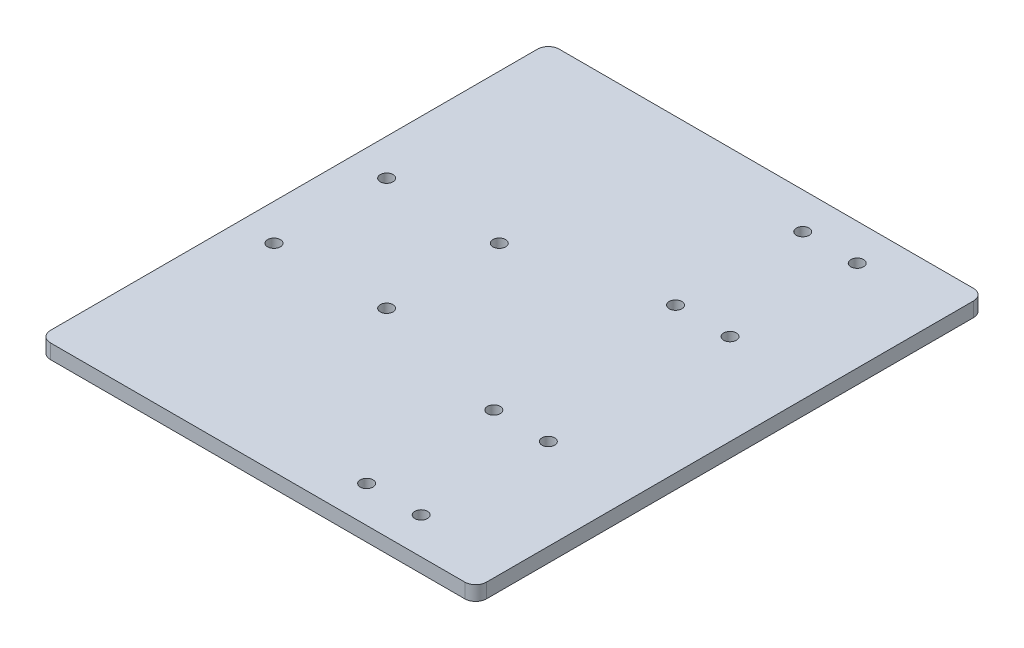
ISO-10303-21;
HEADER;
FILE_DESCRIPTION(('STEP AP214'),'2;1');
FILE_NAME('part.step','',(''),(''),'','','');
FILE_SCHEMA(('AUTOMOTIVE_DESIGN { 1 0 10303 214 1 1 1 1 }'));
ENDSEC;
DATA;
#1=APPLICATION_CONTEXT('core data for automotive mechanical design processes');
#2=APPLICATION_PROTOCOL_DEFINITION('international standard','automotive_design',2000,#1);
#3=PRODUCT_CONTEXT('',#1,'mechanical');
#4=PRODUCT('Part','Part','',(#3));
#5=PRODUCT_RELATED_PRODUCT_CATEGORY('part','',(#4));
#6=PRODUCT_DEFINITION_FORMATION('','',#4);
#7=PRODUCT_DEFINITION_CONTEXT('part definition',#1,'design');
#8=PRODUCT_DEFINITION('design','',#6,#7);
#9=PRODUCT_DEFINITION_SHAPE('','',#8);
#10=(LENGTH_UNIT() NAMED_UNIT(*) SI_UNIT(.MILLI.,.METRE.));
#11=(NAMED_UNIT(*) PLANE_ANGLE_UNIT() SI_UNIT($,.RADIAN.));
#12=(NAMED_UNIT(*) SI_UNIT($,.STERADIAN.) SOLID_ANGLE_UNIT());
#13=UNCERTAINTY_MEASURE_WITH_UNIT(LENGTH_MEASURE(1.E-05),#10,'distance_accuracy_value','');
#14=(GEOMETRIC_REPRESENTATION_CONTEXT(3) GLOBAL_UNCERTAINTY_ASSIGNED_CONTEXT((#13)) GLOBAL_UNIT_ASSIGNED_CONTEXT((#10,
#11,#12)) REPRESENTATION_CONTEXT('',''));
#15=CARTESIAN_POINT('',(0.,0.,0.));
#16=DIRECTION('',(0.,0.,1.));
#17=DIRECTION('',(1.,0.,0.));
#18=AXIS2_PLACEMENT_3D('',#15,#16,#17);
#19=CARTESIAN_POINT('',(0.,4.,0.));
#20=DIRECTION('',(0.,1.,0.));
#21=DIRECTION('',(0.,0.,1.));
#22=AXIS2_PLACEMENT_3D('',#19,#20,#21);
#23=PLANE('',#22);
#24=CARTESIAN_POINT('',(34.9999999999999,4.,25.));
#25=DIRECTION('',(0.,1.,0.));
#26=DIRECTION('',(0.,0.,1.));
#27=AXIS2_PLACEMENT_3D('',#24,#25,#26);
#28=CIRCLE('',#27,1.75);
#29=CARTESIAN_POINT('',(34.9999999999999,4.,26.75));
#30=VERTEX_POINT('',#29);
#31=EDGE_CURVE('E288',#30,#30,#28,.T.);
#32=ORIENTED_EDGE('',*,*,#31,.F.);
#33=EDGE_LOOP('',(#32));
#34=FACE_BOUND('',#33,.T.);
#35=CARTESIAN_POINT('',(20.0000000000004,4.,-25.));
#36=DIRECTION('',(0.,1.,0.));
#37=DIRECTION('',(0.,0.,1.));
#38=AXIS2_PLACEMENT_3D('',#35,#36,#37);
#39=CIRCLE('',#38,1.75);
#40=CARTESIAN_POINT('',(20.0000000000004,4.,-23.25));
#41=VERTEX_POINT('',#40);
#42=EDGE_CURVE('E272',#41,#41,#39,.T.);
#43=ORIENTED_EDGE('',*,*,#42,.F.);
#44=EDGE_LOOP('',(#43));
#45=FACE_BOUND('',#44,.T.);
#46=CARTESIAN_POINT('',(35.,4.,-60.));
#47=DIRECTION('',(0.,1.,0.));
#48=DIRECTION('',(0.,0.,1.));
#49=AXIS2_PLACEMENT_3D('',#46,#47,#48);
#50=CIRCLE('',#49,1.75);
#51=CARTESIAN_POINT('',(35.,4.,-58.25));
#52=VERTEX_POINT('',#51);
#53=EDGE_CURVE('E256',#52,#52,#50,.T.);
#54=ORIENTED_EDGE('',*,*,#53,.F.);
#55=EDGE_LOOP('',(#54));
#56=FACE_BOUND('',#55,.T.);
#57=CARTESIAN_POINT('',(-19.,4.,15.5));
#58=DIRECTION('',(0.,1.,0.));
#59=DIRECTION('',(0.,0.,1.));
#60=AXIS2_PLACEMENT_3D('',#57,#58,#59);
#61=CIRCLE('',#60,1.75);
#62=CARTESIAN_POINT('',(-19.,4.,17.25));
#63=VERTEX_POINT('',#62);
#64=EDGE_CURVE('E240',#63,#63,#61,.T.);
#65=ORIENTED_EDGE('',*,*,#64,.F.);
#66=EDGE_LOOP('',(#65));
#67=FACE_BOUND('',#66,.T.);
#68=CARTESIAN_POINT('',(-50.,4.,15.5));
#69=DIRECTION('',(0.,1.,0.));
#70=DIRECTION('',(0.,0.,1.));
#71=AXIS2_PLACEMENT_3D('',#68,#69,#70);
#72=CIRCLE('',#71,1.75);
#73=CARTESIAN_POINT('',(-50.,4.,17.25));
#74=VERTEX_POINT('',#73);
#75=EDGE_CURVE('E224',#74,#74,#72,.T.);
#76=ORIENTED_EDGE('',*,*,#75,.F.);
#77=EDGE_LOOP('',(#76));
#78=FACE_BOUND('',#77,.T.);
#79=CARTESIAN_POINT('',(-50.,4.,-15.5));
#80=DIRECTION('',(0.,1.,0.));
#81=DIRECTION('',(0.,0.,1.));
#82=AXIS2_PLACEMENT_3D('',#79,#80,#81);
#83=CIRCLE('',#82,1.75);
#84=CARTESIAN_POINT('',(-50.,4.,-13.75));
#85=VERTEX_POINT('',#84);
#86=EDGE_CURVE('E149',#85,#85,#83,.T.);
#87=ORIENTED_EDGE('',*,*,#86,.F.);
#88=EDGE_LOOP('',(#87));
#89=FACE_BOUND('',#88,.T.);
#90=DIRECTION('',(0.,0.,-1.));
#91=VECTOR('',#90,1.);
#92=CARTESIAN_POINT('',(60.,4.,-70.));
#93=LINE('',#92,#91);
#94=CARTESIAN_POINT('',(60.,4.,67.));
#95=VERTEX_POINT('',#94);
#96=CARTESIAN_POINT('',(60.,4.,-67.));
#97=VERTEX_POINT('',#96);
#98=EDGE_CURVE('E155',#95,#97,#93,.T.);
#99=ORIENTED_EDGE('',*,*,#98,.T.);
#100=CARTESIAN_POINT('',(57.,4.,-67.));
#101=DIRECTION('',(0.,1.,0.));
#102=DIRECTION('',(0.,0.,1.));
#103=AXIS2_PLACEMENT_3D('',#100,#101,#102);
#104=CIRCLE('',#103,3.);
#105=CARTESIAN_POINT('',(57.,4.,-70.));
#106=VERTEX_POINT('',#105);
#107=EDGE_CURVE('E179',#97,#106,#104,.T.);
#108=ORIENTED_EDGE('',*,*,#107,.T.);
#109=DIRECTION('',(-1.,0.,0.));
#110=VECTOR('',#109,1.);
#111=CARTESIAN_POINT('',(-60.,4.,-70.));
#112=LINE('',#111,#110);
#113=CARTESIAN_POINT('',(-57.,4.,-70.));
#114=VERTEX_POINT('',#113);
#115=EDGE_CURVE('E132',#106,#114,#112,.T.);
#116=ORIENTED_EDGE('',*,*,#115,.T.);
#117=CARTESIAN_POINT('',(-57.,4.,-67.));
#118=DIRECTION('',(0.,1.,0.));
#119=DIRECTION('',(0.,0.,1.));
#120=AXIS2_PLACEMENT_3D('',#117,#118,#119);
#121=CIRCLE('',#120,3.);
#122=CARTESIAN_POINT('',(-60.,4.,-67.));
#123=VERTEX_POINT('',#122);
#124=EDGE_CURVE('E171',#114,#123,#121,.T.);
#125=ORIENTED_EDGE('',*,*,#124,.T.);
#126=DIRECTION('',(0.,0.,1.));
#127=VECTOR('',#126,1.);
#128=CARTESIAN_POINT('',(-60.,4.,-70.));
#129=LINE('',#128,#127);
#130=CARTESIAN_POINT('',(-60.,4.,67.));
#131=VERTEX_POINT('',#130);
#132=EDGE_CURVE('E194',#123,#131,#129,.T.);
#133=ORIENTED_EDGE('',*,*,#132,.T.);
#134=CARTESIAN_POINT('',(-57.,4.,67.));
#135=DIRECTION('',(0.,1.,0.));
#136=DIRECTION('',(0.,0.,1.));
#137=AXIS2_PLACEMENT_3D('',#134,#135,#136);
#138=CIRCLE('',#137,3.);
#139=CARTESIAN_POINT('',(-57.,4.,70.));
#140=VERTEX_POINT('',#139);
#141=EDGE_CURVE('E67',#131,#140,#138,.T.);
#142=ORIENTED_EDGE('',*,*,#141,.T.);
#143=DIRECTION('',(1.,0.,0.));
#144=VECTOR('',#143,1.);
#145=CARTESIAN_POINT('',(-60.,4.,70.));
#146=LINE('',#145,#144);
#147=CARTESIAN_POINT('',(57.,4.,70.));
#148=VERTEX_POINT('',#147);
#149=EDGE_CURVE('E157',#140,#148,#146,.T.);
#150=ORIENTED_EDGE('',*,*,#149,.T.);
#151=CARTESIAN_POINT('',(57.,4.,67.));
#152=DIRECTION('',(0.,1.,0.));
#153=DIRECTION('',(0.,0.,1.));
#154=AXIS2_PLACEMENT_3D('',#151,#152,#153);
#155=CIRCLE('',#154,3.);
#156=EDGE_CURVE('E176',#148,#95,#155,.T.);
#157=ORIENTED_EDGE('',*,*,#156,.T.);
#158=EDGE_LOOP('',(#99,#108,#116,#125,#133,#142,#150,#157));
#159=FACE_BOUND('',#158,.T.);
#160=CARTESIAN_POINT('',(-19.,4.,-15.5));
#161=DIRECTION('',(0.,1.,0.));
#162=DIRECTION('',(0.,0.,1.));
#163=AXIS2_PLACEMENT_3D('',#160,#161,#162);
#164=CIRCLE('',#163,1.75);
#165=CARTESIAN_POINT('',(-19.,4.,-13.75));
#166=VERTEX_POINT('',#165);
#167=EDGE_CURVE('E216',#166,#166,#164,.T.);
#168=ORIENTED_EDGE('',*,*,#167,.F.);
#169=EDGE_LOOP('',(#168));
#170=FACE_BOUND('',#169,.T.);
#171=CARTESIAN_POINT('',(20.,4.,-60.));
#172=DIRECTION('',(0.,1.,0.));
#173=DIRECTION('',(0.,0.,1.));
#174=AXIS2_PLACEMENT_3D('',#171,#172,#173);
#175=CIRCLE('',#174,1.75);
#176=CARTESIAN_POINT('',(20.,4.,-58.25));
#177=VERTEX_POINT('',#176);
#178=EDGE_CURVE('E232',#177,#177,#175,.T.);
#179=ORIENTED_EDGE('',*,*,#178,.F.);
#180=EDGE_LOOP('',(#179));
#181=FACE_BOUND('',#180,.T.);
#182=CARTESIAN_POINT('',(20.,4.,60.));
#183=DIRECTION('',(0.,1.,0.));
#184=DIRECTION('',(0.,0.,1.));
#185=AXIS2_PLACEMENT_3D('',#182,#183,#184);
#186=CIRCLE('',#185,1.75);
#187=CARTESIAN_POINT('',(20.,4.,61.75));
#188=VERTEX_POINT('',#187);
#189=EDGE_CURVE('E248',#188,#188,#186,.T.);
#190=ORIENTED_EDGE('',*,*,#189,.F.);
#191=EDGE_LOOP('',(#190));
#192=FACE_BOUND('',#191,.T.);
#193=CARTESIAN_POINT('',(35.0000000000004,4.,-25.));
#194=DIRECTION('',(0.,1.,0.));
#195=DIRECTION('',(0.,0.,1.));
#196=AXIS2_PLACEMENT_3D('',#193,#194,#195);
#197=CIRCLE('',#196,1.75);
#198=CARTESIAN_POINT('',(35.0000000000004,4.,-23.25));
#199=VERTEX_POINT('',#198);
#200=EDGE_CURVE('E264',#199,#199,#197,.T.);
#201=ORIENTED_EDGE('',*,*,#200,.F.);
#202=EDGE_LOOP('',(#201));
#203=FACE_BOUND('',#202,.T.);
#204=CARTESIAN_POINT('',(35.,4.,60.));
#205=DIRECTION('',(0.,1.,0.));
#206=DIRECTION('',(0.,0.,1.));
#207=AXIS2_PLACEMENT_3D('',#204,#205,#206);
#208=CIRCLE('',#207,1.75);
#209=CARTESIAN_POINT('',(35.,4.,61.75));
#210=VERTEX_POINT('',#209);
#211=EDGE_CURVE('E280',#210,#210,#208,.T.);
#212=ORIENTED_EDGE('',*,*,#211,.F.);
#213=EDGE_LOOP('',(#212));
#214=FACE_BOUND('',#213,.T.);
#215=CARTESIAN_POINT('',(19.9999999999999,4.,25.));
#216=DIRECTION('',(0.,1.,0.));
#217=DIRECTION('',(0.,0.,1.));
#218=AXIS2_PLACEMENT_3D('',#215,#216,#217);
#219=CIRCLE('',#218,1.75);
#220=CARTESIAN_POINT('',(19.9999999999999,4.,26.75));
#221=VERTEX_POINT('',#220);
#222=EDGE_CURVE('E296',#221,#221,#219,.T.);
#223=ORIENTED_EDGE('',*,*,#222,.F.);
#224=EDGE_LOOP('',(#223));
#225=FACE_BOUND('',#224,.T.);
#226=ADVANCED_FACE('F44',(#34,#45,#56,#67,#78,#89,#159,#170,#181,#192,#203,#214,#225),#23,.T.);
#227=CARTESIAN_POINT('',(0.,0.,0.));
#228=DIRECTION('',(0.,1.,0.));
#229=DIRECTION('',(0.,0.,1.));
#230=AXIS2_PLACEMENT_3D('',#227,#228,#229);
#231=PLANE('',#230);
#232=DIRECTION('',(-1.,0.,0.));
#233=VECTOR('',#232,1.);
#234=CARTESIAN_POINT('',(-60.,0.,-70.));
#235=LINE('',#234,#233);
#236=CARTESIAN_POINT('',(57.,0.,-70.));
#237=VERTEX_POINT('',#236);
#238=CARTESIAN_POINT('',(-57.,0.,-70.));
#239=VERTEX_POINT('',#238);
#240=EDGE_CURVE('E129',#237,#239,#235,.T.);
#241=ORIENTED_EDGE('',*,*,#240,.F.);
#242=CARTESIAN_POINT('',(57.,0.,-67.));
#243=DIRECTION('',(0.,1.,0.));
#244=DIRECTION('',(0.,0.,1.));
#245=AXIS2_PLACEMENT_3D('',#242,#243,#244);
#246=CIRCLE('',#245,3.);
#247=CARTESIAN_POINT('',(60.,0.,-67.));
#248=VERTEX_POINT('',#247);
#249=EDGE_CURVE('E111',#237,#248,#246,.F.);
#250=ORIENTED_EDGE('',*,*,#249,.T.);
#251=DIRECTION('',(0.,0.,-1.));
#252=VECTOR('',#251,1.);
#253=CARTESIAN_POINT('',(60.,0.,-70.));
#254=LINE('',#253,#252);
#255=CARTESIAN_POINT('',(60.,0.,67.));
#256=VERTEX_POINT('',#255);
#257=EDGE_CURVE('E142',#256,#248,#254,.T.);
#258=ORIENTED_EDGE('',*,*,#257,.F.);
#259=CARTESIAN_POINT('',(57.,0.,67.));
#260=DIRECTION('',(0.,1.,0.));
#261=DIRECTION('',(0.,0.,1.));
#262=AXIS2_PLACEMENT_3D('',#259,#260,#261);
#263=CIRCLE('',#262,3.);
#264=CARTESIAN_POINT('',(57.,0.,70.));
#265=VERTEX_POINT('',#264);
#266=EDGE_CURVE('E123',#256,#265,#263,.F.);
#267=ORIENTED_EDGE('',*,*,#266,.T.);
#268=DIRECTION('',(1.,0.,0.));
#269=VECTOR('',#268,1.);
#270=CARTESIAN_POINT('',(-60.,0.,70.));
#271=LINE('',#270,#269);
#272=CARTESIAN_POINT('',(-57.,0.,70.));
#273=VERTEX_POINT('',#272);
#274=EDGE_CURVE('E147',#273,#265,#271,.T.);
#275=ORIENTED_EDGE('',*,*,#274,.F.);
#276=CARTESIAN_POINT('',(-57.,0.,67.));
#277=DIRECTION('',(0.,1.,0.));
#278=DIRECTION('',(0.,0.,1.));
#279=AXIS2_PLACEMENT_3D('',#276,#277,#278);
#280=CIRCLE('',#279,3.);
#281=CARTESIAN_POINT('',(-60.,0.,67.));
#282=VERTEX_POINT('',#281);
#283=EDGE_CURVE('E161',#273,#282,#280,.F.);
#284=ORIENTED_EDGE('',*,*,#283,.T.);
#285=DIRECTION('',(0.,0.,1.));
#286=VECTOR('',#285,1.);
#287=CARTESIAN_POINT('',(-60.,0.,-70.));
#288=LINE('',#287,#286);
#289=CARTESIAN_POINT('',(-60.,0.,-67.));
#290=VERTEX_POINT('',#289);
#291=EDGE_CURVE('E141',#290,#282,#288,.T.);
#292=ORIENTED_EDGE('',*,*,#291,.F.);
#293=CARTESIAN_POINT('',(-57.,0.,-67.));
#294=DIRECTION('',(0.,1.,0.));
#295=DIRECTION('',(0.,0.,1.));
#296=AXIS2_PLACEMENT_3D('',#293,#294,#295);
#297=CIRCLE('',#296,3.);
#298=EDGE_CURVE('E134',#290,#239,#297,.F.);
#299=ORIENTED_EDGE('',*,*,#298,.T.);
#300=EDGE_LOOP('',(#241,#250,#258,#267,#275,#284,#292,#299));
#301=FACE_BOUND('',#300,.T.);
#302=CARTESIAN_POINT('',(-50.,0.,-15.5));
#303=DIRECTION('',(0.,1.,0.));
#304=DIRECTION('',(0.,0.,1.));
#305=AXIS2_PLACEMENT_3D('',#302,#303,#304);
#306=CIRCLE('',#305,1.75);
#307=CARTESIAN_POINT('',(-50.,0.,-13.75));
#308=VERTEX_POINT('',#307);
#309=EDGE_CURVE('E212',#308,#308,#306,.T.);
#310=ORIENTED_EDGE('',*,*,#309,.T.);
#311=EDGE_LOOP('',(#310));
#312=FACE_BOUND('',#311,.T.);
#313=CARTESIAN_POINT('',(-19.,0.,-15.5));
#314=DIRECTION('',(0.,1.,0.));
#315=DIRECTION('',(0.,0.,1.));
#316=AXIS2_PLACEMENT_3D('',#313,#314,#315);
#317=CIRCLE('',#316,1.75);
#318=CARTESIAN_POINT('',(-19.,0.,-13.75));
#319=VERTEX_POINT('',#318);
#320=EDGE_CURVE('E220',#319,#319,#317,.T.);
#321=ORIENTED_EDGE('',*,*,#320,.T.);
#322=EDGE_LOOP('',(#321));
#323=FACE_BOUND('',#322,.T.);
#324=CARTESIAN_POINT('',(-50.,0.,15.5));
#325=DIRECTION('',(0.,1.,0.));
#326=DIRECTION('',(0.,0.,1.));
#327=AXIS2_PLACEMENT_3D('',#324,#325,#326);
#328=CIRCLE('',#327,1.75);
#329=CARTESIAN_POINT('',(-50.,0.,17.25));
#330=VERTEX_POINT('',#329);
#331=EDGE_CURVE('E228',#330,#330,#328,.T.);
#332=ORIENTED_EDGE('',*,*,#331,.T.);
#333=EDGE_LOOP('',(#332));
#334=FACE_BOUND('',#333,.T.);
#335=CARTESIAN_POINT('',(20.,0.,-60.));
#336=DIRECTION('',(0.,1.,0.));
#337=DIRECTION('',(0.,0.,1.));
#338=AXIS2_PLACEMENT_3D('',#335,#336,#337);
#339=CIRCLE('',#338,1.75);
#340=CARTESIAN_POINT('',(20.,0.,-58.25));
#341=VERTEX_POINT('',#340);
#342=EDGE_CURVE('E236',#341,#341,#339,.T.);
#343=ORIENTED_EDGE('',*,*,#342,.T.);
#344=EDGE_LOOP('',(#343));
#345=FACE_BOUND('',#344,.T.);
#346=CARTESIAN_POINT('',(-19.,0.,15.5));
#347=DIRECTION('',(0.,1.,0.));
#348=DIRECTION('',(0.,0.,1.));
#349=AXIS2_PLACEMENT_3D('',#346,#347,#348);
#350=CIRCLE('',#349,1.75);
#351=CARTESIAN_POINT('',(-19.,0.,17.25));
#352=VERTEX_POINT('',#351);
#353=EDGE_CURVE('E244',#352,#352,#350,.T.);
#354=ORIENTED_EDGE('',*,*,#353,.T.);
#355=EDGE_LOOP('',(#354));
#356=FACE_BOUND('',#355,.T.);
#357=CARTESIAN_POINT('',(20.,0.,60.));
#358=DIRECTION('',(0.,1.,0.));
#359=DIRECTION('',(0.,0.,1.));
#360=AXIS2_PLACEMENT_3D('',#357,#358,#359);
#361=CIRCLE('',#360,1.75);
#362=CARTESIAN_POINT('',(20.,0.,61.75));
#363=VERTEX_POINT('',#362);
#364=EDGE_CURVE('E252',#363,#363,#361,.T.);
#365=ORIENTED_EDGE('',*,*,#364,.T.);
#366=EDGE_LOOP('',(#365));
#367=FACE_BOUND('',#366,.T.);
#368=CARTESIAN_POINT('',(35.,0.,-60.));
#369=DIRECTION('',(0.,1.,0.));
#370=DIRECTION('',(0.,0.,1.));
#371=AXIS2_PLACEMENT_3D('',#368,#369,#370);
#372=CIRCLE('',#371,1.75);
#373=CARTESIAN_POINT('',(35.,0.,-58.25));
#374=VERTEX_POINT('',#373);
#375=EDGE_CURVE('E260',#374,#374,#372,.T.);
#376=ORIENTED_EDGE('',*,*,#375,.T.);
#377=EDGE_LOOP('',(#376));
#378=FACE_BOUND('',#377,.T.);
#379=CARTESIAN_POINT('',(35.0000000000004,0.,-25.));
#380=DIRECTION('',(0.,1.,0.));
#381=DIRECTION('',(0.,0.,1.));
#382=AXIS2_PLACEMENT_3D('',#379,#380,#381);
#383=CIRCLE('',#382,1.75);
#384=CARTESIAN_POINT('',(35.0000000000004,0.,-23.25));
#385=VERTEX_POINT('',#384);
#386=EDGE_CURVE('E268',#385,#385,#383,.T.);
#387=ORIENTED_EDGE('',*,*,#386,.T.);
#388=EDGE_LOOP('',(#387));
#389=FACE_BOUND('',#388,.T.);
#390=CARTESIAN_POINT('',(20.0000000000004,0.,-25.));
#391=DIRECTION('',(0.,1.,0.));
#392=DIRECTION('',(0.,0.,1.));
#393=AXIS2_PLACEMENT_3D('',#390,#391,#392);
#394=CIRCLE('',#393,1.75);
#395=CARTESIAN_POINT('',(20.0000000000004,0.,-23.25));
#396=VERTEX_POINT('',#395);
#397=EDGE_CURVE('E276',#396,#396,#394,.T.);
#398=ORIENTED_EDGE('',*,*,#397,.T.);
#399=EDGE_LOOP('',(#398));
#400=FACE_BOUND('',#399,.T.);
#401=CARTESIAN_POINT('',(35.,0.,60.));
#402=DIRECTION('',(0.,1.,0.));
#403=DIRECTION('',(0.,0.,1.));
#404=AXIS2_PLACEMENT_3D('',#401,#402,#403);
#405=CIRCLE('',#404,1.75);
#406=CARTESIAN_POINT('',(35.,0.,61.75));
#407=VERTEX_POINT('',#406);
#408=EDGE_CURVE('E284',#407,#407,#405,.T.);
#409=ORIENTED_EDGE('',*,*,#408,.T.);
#410=EDGE_LOOP('',(#409));
#411=FACE_BOUND('',#410,.T.);
#412=CARTESIAN_POINT('',(34.9999999999999,0.,25.));
#413=DIRECTION('',(0.,1.,0.));
#414=DIRECTION('',(0.,0.,1.));
#415=AXIS2_PLACEMENT_3D('',#412,#413,#414);
#416=CIRCLE('',#415,1.75);
#417=CARTESIAN_POINT('',(34.9999999999999,0.,26.75));
#418=VERTEX_POINT('',#417);
#419=EDGE_CURVE('E292',#418,#418,#416,.T.);
#420=ORIENTED_EDGE('',*,*,#419,.T.);
#421=EDGE_LOOP('',(#420));
#422=FACE_BOUND('',#421,.T.);
#423=CARTESIAN_POINT('',(19.9999999999999,0.,25.));
#424=DIRECTION('',(0.,1.,0.));
#425=DIRECTION('',(0.,0.,1.));
#426=AXIS2_PLACEMENT_3D('',#423,#424,#425);
#427=CIRCLE('',#426,1.75);
#428=CARTESIAN_POINT('',(19.9999999999999,0.,26.75));
#429=VERTEX_POINT('',#428);
#430=EDGE_CURVE('E300',#429,#429,#427,.T.);
#431=ORIENTED_EDGE('',*,*,#430,.T.);
#432=EDGE_LOOP('',(#431));
#433=FACE_BOUND('',#432,.T.);
#434=ADVANCED_FACE('F137',(#301,#312,#323,#334,#345,#356,#367,#378,#389,#400,#411,#422,#433),
#231,.F.);
#435=CARTESIAN_POINT('',(60.,4.,-70.));
#436=DIRECTION('',(-1.,0.,0.));
#437=DIRECTION('',(0.,0.,1.));
#438=AXIS2_PLACEMENT_3D('',#435,#436,#437);
#439=PLANE('',#438);
#440=ORIENTED_EDGE('',*,*,#257,.T.);
#441=DIRECTION('',(0.,-1.,0.));
#442=VECTOR('',#441,1.);
#443=CARTESIAN_POINT('',(60.,4.,-67.));
#444=LINE('',#443,#442);
#445=EDGE_CURVE('E116',#248,#97,#444,.F.);
#446=ORIENTED_EDGE('',*,*,#445,.T.);
#447=ORIENTED_EDGE('',*,*,#98,.F.);
#448=DIRECTION('',(0.,-1.,0.));
#449=VECTOR('',#448,1.);
#450=CARTESIAN_POINT('',(60.,4.,67.));
#451=LINE('',#450,#449);
#452=EDGE_CURVE('E122',#95,#256,#451,.T.);
#453=ORIENTED_EDGE('',*,*,#452,.T.);
#454=EDGE_LOOP('',(#440,#446,#447,#453));
#455=FACE_BOUND('',#454,.T.);
#456=ADVANCED_FACE('F317',(#455),#439,.F.);
#457=CARTESIAN_POINT('',(-60.,4.,-70.));
#458=DIRECTION('',(0.,0.,1.));
#459=DIRECTION('',(1.,0.,0.));
#460=AXIS2_PLACEMENT_3D('',#457,#458,#459);
#461=PLANE('',#460);
#462=ORIENTED_EDGE('',*,*,#115,.F.);
#463=DIRECTION('',(0.,-1.,0.));
#464=VECTOR('',#463,1.);
#465=CARTESIAN_POINT('',(57.,4.,-70.));
#466=LINE('',#465,#464);
#467=EDGE_CURVE('E115',#106,#237,#466,.T.);
#468=ORIENTED_EDGE('',*,*,#467,.T.);
#469=ORIENTED_EDGE('',*,*,#240,.T.);
#470=DIRECTION('',(0.,-1.,0.));
#471=VECTOR('',#470,1.);
#472=CARTESIAN_POINT('',(-57.,4.,-70.));
#473=LINE('',#472,#471);
#474=EDGE_CURVE('E135',#239,#114,#473,.F.);
#475=ORIENTED_EDGE('',*,*,#474,.T.);
#476=EDGE_LOOP('',(#462,#468,#469,#475));
#477=FACE_BOUND('',#476,.T.);
#478=ADVANCED_FACE('F128',(#477),#461,.F.);
#479=CARTESIAN_POINT('',(-60.,4.,-70.));
#480=DIRECTION('',(1.,0.,0.));
#481=DIRECTION('',(0.,0.,-1.));
#482=AXIS2_PLACEMENT_3D('',#479,#480,#481);
#483=PLANE('',#482);
#484=ORIENTED_EDGE('',*,*,#291,.T.);
#485=DIRECTION('',(0.,-1.,0.));
#486=VECTOR('',#485,1.);
#487=CARTESIAN_POINT('',(-60.,4.,67.));
#488=LINE('',#487,#486);
#489=EDGE_CURVE('E11',#282,#131,#488,.F.);
#490=ORIENTED_EDGE('',*,*,#489,.T.);
#491=ORIENTED_EDGE('',*,*,#132,.F.);
#492=DIRECTION('',(0.,-1.,0.));
#493=VECTOR('',#492,1.);
#494=CARTESIAN_POINT('',(-60.,4.,-67.));
#495=LINE('',#494,#493);
#496=EDGE_CURVE('E53',#123,#290,#495,.T.);
#497=ORIENTED_EDGE('',*,*,#496,.T.);
#498=EDGE_LOOP('',(#484,#490,#491,#497));
#499=FACE_BOUND('',#498,.T.);
#500=ADVANCED_FACE('F192',(#499),#483,.F.);
#501=CARTESIAN_POINT('',(-60.,4.,70.));
#502=DIRECTION('',(0.,0.,-1.));
#503=DIRECTION('',(-1.,0.,0.));
#504=AXIS2_PLACEMENT_3D('',#501,#502,#503);
#505=PLANE('',#504);
#506=ORIENTED_EDGE('',*,*,#274,.T.);
#507=DIRECTION('',(0.,-1.,0.));
#508=VECTOR('',#507,1.);
#509=CARTESIAN_POINT('',(57.,4.,70.));
#510=LINE('',#509,#508);
#511=EDGE_CURVE('E60',#265,#148,#510,.F.);
#512=ORIENTED_EDGE('',*,*,#511,.T.);
#513=ORIENTED_EDGE('',*,*,#149,.F.);
#514=DIRECTION('',(0.,-1.,0.));
#515=VECTOR('',#514,1.);
#516=CARTESIAN_POINT('',(-57.,4.,70.));
#517=LINE('',#516,#515);
#518=EDGE_CURVE('E182',#140,#273,#517,.T.);
#519=ORIENTED_EDGE('',*,*,#518,.T.);
#520=EDGE_LOOP('',(#506,#512,#513,#519));
#521=FACE_BOUND('',#520,.T.);
#522=ADVANCED_FACE('F201',(#521),#505,.F.);
#523=CARTESIAN_POINT('',(-50.,4.,-15.5));
#524=DIRECTION('',(0.,-1.,0.));
#525=DIRECTION('',(0.,0.,-1.));
#526=AXIS2_PLACEMENT_3D('',#523,#524,#525);
#527=CYLINDRICAL_SURFACE('',#526,1.75);
#528=ORIENTED_EDGE('',*,*,#86,.T.);
#529=EDGE_LOOP('',(#528));
#530=FACE_BOUND('',#529,.T.);
#531=ORIENTED_EDGE('',*,*,#309,.F.);
#532=EDGE_LOOP('',(#531));
#533=FACE_BOUND('',#532,.T.);
#534=ADVANCED_FACE('F322',(#530,#533),#527,.F.);
#535=CARTESIAN_POINT('',(-19.,4.,-15.5));
#536=DIRECTION('',(0.,-1.,0.));
#537=DIRECTION('',(0.,0.,-1.));
#538=AXIS2_PLACEMENT_3D('',#535,#536,#537);
#539=CYLINDRICAL_SURFACE('',#538,1.75);
#540=ORIENTED_EDGE('',*,*,#167,.T.);
#541=EDGE_LOOP('',(#540));
#542=FACE_BOUND('',#541,.T.);
#543=ORIENTED_EDGE('',*,*,#320,.F.);
#544=EDGE_LOOP('',(#543));
#545=FACE_BOUND('',#544,.T.);
#546=ADVANCED_FACE('F403',(#542,#545),#539,.F.);
#547=CARTESIAN_POINT('',(-50.,4.,15.5));
#548=DIRECTION('',(0.,-1.,0.));
#549=DIRECTION('',(0.,0.,-1.));
#550=AXIS2_PLACEMENT_3D('',#547,#548,#549);
#551=CYLINDRICAL_SURFACE('',#550,1.75);
#552=ORIENTED_EDGE('',*,*,#75,.T.);
#553=EDGE_LOOP('',(#552));
#554=FACE_BOUND('',#553,.T.);
#555=ORIENTED_EDGE('',*,*,#331,.F.);
#556=EDGE_LOOP('',(#555));
#557=FACE_BOUND('',#556,.T.);
#558=ADVANCED_FACE('F400',(#554,#557),#551,.F.);
#559=CARTESIAN_POINT('',(20.,4.,-60.));
#560=DIRECTION('',(0.,-1.,0.));
#561=DIRECTION('',(0.,0.,-1.));
#562=AXIS2_PLACEMENT_3D('',#559,#560,#561);
#563=CYLINDRICAL_SURFACE('',#562,1.75);
#564=ORIENTED_EDGE('',*,*,#178,.T.);
#565=EDGE_LOOP('',(#564));
#566=FACE_BOUND('',#565,.T.);
#567=ORIENTED_EDGE('',*,*,#342,.F.);
#568=EDGE_LOOP('',(#567));
#569=FACE_BOUND('',#568,.T.);
#570=ADVANCED_FACE('F396',(#566,#569),#563,.F.);
#571=CARTESIAN_POINT('',(-19.,4.,15.5));
#572=DIRECTION('',(0.,-1.,0.));
#573=DIRECTION('',(0.,0.,-1.));
#574=AXIS2_PLACEMENT_3D('',#571,#572,#573);
#575=CYLINDRICAL_SURFACE('',#574,1.75);
#576=ORIENTED_EDGE('',*,*,#64,.T.);
#577=EDGE_LOOP('',(#576));
#578=FACE_BOUND('',#577,.T.);
#579=ORIENTED_EDGE('',*,*,#353,.F.);
#580=EDGE_LOOP('',(#579));
#581=FACE_BOUND('',#580,.T.);
#582=ADVANCED_FACE('F392',(#578,#581),#575,.F.);
#583=CARTESIAN_POINT('',(20.,4.,60.));
#584=DIRECTION('',(0.,-1.,0.));
#585=DIRECTION('',(0.,0.,-1.));
#586=AXIS2_PLACEMENT_3D('',#583,#584,#585);
#587=CYLINDRICAL_SURFACE('',#586,1.75);
#588=ORIENTED_EDGE('',*,*,#189,.T.);
#589=EDGE_LOOP('',(#588));
#590=FACE_BOUND('',#589,.T.);
#591=ORIENTED_EDGE('',*,*,#364,.F.);
#592=EDGE_LOOP('',(#591));
#593=FACE_BOUND('',#592,.T.);
#594=ADVANCED_FACE('F388',(#590,#593),#587,.F.);
#595=CARTESIAN_POINT('',(35.,4.,-60.));
#596=DIRECTION('',(0.,-1.,0.));
#597=DIRECTION('',(0.,0.,-1.));
#598=AXIS2_PLACEMENT_3D('',#595,#596,#597);
#599=CYLINDRICAL_SURFACE('',#598,1.75);
#600=ORIENTED_EDGE('',*,*,#53,.T.);
#601=EDGE_LOOP('',(#600));
#602=FACE_BOUND('',#601,.T.);
#603=ORIENTED_EDGE('',*,*,#375,.F.);
#604=EDGE_LOOP('',(#603));
#605=FACE_BOUND('',#604,.T.);
#606=ADVANCED_FACE('F384',(#602,#605),#599,.F.);
#607=CARTESIAN_POINT('',(35.0000000000004,4.,-25.));
#608=DIRECTION('',(0.,-1.,0.));
#609=DIRECTION('',(0.,0.,-1.));
#610=AXIS2_PLACEMENT_3D('',#607,#608,#609);
#611=CYLINDRICAL_SURFACE('',#610,1.75);
#612=ORIENTED_EDGE('',*,*,#200,.T.);
#613=EDGE_LOOP('',(#612));
#614=FACE_BOUND('',#613,.T.);
#615=ORIENTED_EDGE('',*,*,#386,.F.);
#616=EDGE_LOOP('',(#615));
#617=FACE_BOUND('',#616,.T.);
#618=ADVANCED_FACE('F380',(#614,#617),#611,.F.);
#619=CARTESIAN_POINT('',(20.0000000000004,4.,-25.));
#620=DIRECTION('',(0.,-1.,0.));
#621=DIRECTION('',(0.,0.,-1.));
#622=AXIS2_PLACEMENT_3D('',#619,#620,#621);
#623=CYLINDRICAL_SURFACE('',#622,1.75);
#624=ORIENTED_EDGE('',*,*,#42,.T.);
#625=EDGE_LOOP('',(#624));
#626=FACE_BOUND('',#625,.T.);
#627=ORIENTED_EDGE('',*,*,#397,.F.);
#628=EDGE_LOOP('',(#627));
#629=FACE_BOUND('',#628,.T.);
#630=ADVANCED_FACE('F362',(#626,#629),#623,.F.);
#631=CARTESIAN_POINT('',(35.,4.,60.));
#632=DIRECTION('',(0.,-1.,0.));
#633=DIRECTION('',(0.,0.,-1.));
#634=AXIS2_PLACEMENT_3D('',#631,#632,#633);
#635=CYLINDRICAL_SURFACE('',#634,1.75);
#636=ORIENTED_EDGE('',*,*,#211,.T.);
#637=EDGE_LOOP('',(#636));
#638=FACE_BOUND('',#637,.T.);
#639=ORIENTED_EDGE('',*,*,#408,.F.);
#640=EDGE_LOOP('',(#639));
#641=FACE_BOUND('',#640,.T.);
#642=ADVANCED_FACE('F358',(#638,#641),#635,.F.);
#643=CARTESIAN_POINT('',(34.9999999999999,4.,25.));
#644=DIRECTION('',(0.,-1.,0.));
#645=DIRECTION('',(0.,0.,-1.));
#646=AXIS2_PLACEMENT_3D('',#643,#644,#645);
#647=CYLINDRICAL_SURFACE('',#646,1.75);
#648=ORIENTED_EDGE('',*,*,#31,.T.);
#649=EDGE_LOOP('',(#648));
#650=FACE_BOUND('',#649,.T.);
#651=ORIENTED_EDGE('',*,*,#419,.F.);
#652=EDGE_LOOP('',(#651));
#653=FACE_BOUND('',#652,.T.);
#654=ADVANCED_FACE('F361',(#650,#653),#647,.F.);
#655=CARTESIAN_POINT('',(19.9999999999999,4.,25.));
#656=DIRECTION('',(0.,-1.,0.));
#657=DIRECTION('',(0.,0.,-1.));
#658=AXIS2_PLACEMENT_3D('',#655,#656,#657);
#659=CYLINDRICAL_SURFACE('',#658,1.75);
#660=ORIENTED_EDGE('',*,*,#222,.T.);
#661=EDGE_LOOP('',(#660));
#662=FACE_BOUND('',#661,.T.);
#663=ORIENTED_EDGE('',*,*,#430,.F.);
#664=EDGE_LOOP('',(#663));
#665=FACE_BOUND('',#664,.T.);
#666=ADVANCED_FACE('F308',(#662,#665),#659,.F.);
#667=CARTESIAN_POINT('',(57.,4.,-67.));
#668=DIRECTION('',(0.,-1.,0.));
#669=DIRECTION('',(0.,0.,-1.));
#670=AXIS2_PLACEMENT_3D('',#667,#668,#669);
#671=CYLINDRICAL_SURFACE('',#670,3.);
#672=ORIENTED_EDGE('',*,*,#107,.F.);
#673=ORIENTED_EDGE('',*,*,#445,.F.);
#674=ORIENTED_EDGE('',*,*,#249,.F.);
#675=ORIENTED_EDGE('',*,*,#467,.F.);
#676=EDGE_LOOP('',(#672,#673,#674,#675));
#677=FACE_BOUND('',#676,.T.);
#678=ADVANCED_FACE('F114',(#677),#671,.T.);
#679=CARTESIAN_POINT('',(57.,4.,67.));
#680=DIRECTION('',(0.,-1.,0.));
#681=DIRECTION('',(0.,0.,-1.));
#682=AXIS2_PLACEMENT_3D('',#679,#680,#681);
#683=CYLINDRICAL_SURFACE('',#682,3.);
#684=ORIENTED_EDGE('',*,*,#156,.F.);
#685=ORIENTED_EDGE('',*,*,#511,.F.);
#686=ORIENTED_EDGE('',*,*,#266,.F.);
#687=ORIENTED_EDGE('',*,*,#452,.F.);
#688=EDGE_LOOP('',(#684,#685,#686,#687));
#689=FACE_BOUND('',#688,.T.);
#690=ADVANCED_FACE('F336',(#689),#683,.T.);
#691=CARTESIAN_POINT('',(-57.,4.,67.));
#692=DIRECTION('',(0.,-1.,0.));
#693=DIRECTION('',(0.,0.,-1.));
#694=AXIS2_PLACEMENT_3D('',#691,#692,#693);
#695=CYLINDRICAL_SURFACE('',#694,3.);
#696=ORIENTED_EDGE('',*,*,#141,.F.);
#697=ORIENTED_EDGE('',*,*,#489,.F.);
#698=ORIENTED_EDGE('',*,*,#283,.F.);
#699=ORIENTED_EDGE('',*,*,#518,.F.);
#700=EDGE_LOOP('',(#696,#697,#698,#699));
#701=FACE_BOUND('',#700,.T.);
#702=ADVANCED_FACE('F200',(#701),#695,.T.);
#703=CARTESIAN_POINT('',(-57.,4.,-67.));
#704=DIRECTION('',(0.,-1.,0.));
#705=DIRECTION('',(0.,0.,-1.));
#706=AXIS2_PLACEMENT_3D('',#703,#704,#705);
#707=CYLINDRICAL_SURFACE('',#706,3.);
#708=ORIENTED_EDGE('',*,*,#124,.F.);
#709=ORIENTED_EDGE('',*,*,#474,.F.);
#710=ORIENTED_EDGE('',*,*,#298,.F.);
#711=ORIENTED_EDGE('',*,*,#496,.F.);
#712=EDGE_LOOP('',(#708,#709,#710,#711));
#713=FACE_BOUND('',#712,.T.);
#714=ADVANCED_FACE('F46',(#713),#707,.T.);
#715=CLOSED_SHELL('',(#226,#434,#456,#478,#500,#522,#534,#546,#558,#570,#582,#594,#606,#618,
#630,#642,#654,#666,#678,#690,#702,#714));
#716=MANIFOLD_SOLID_BREP('B2',#715);
#717=ADVANCED_BREP_SHAPE_REPRESENTATION('',(#18,#716),#14);
#718=SHAPE_DEFINITION_REPRESENTATION(#9,#717);
ENDSEC;
END-ISO-10303-21;
